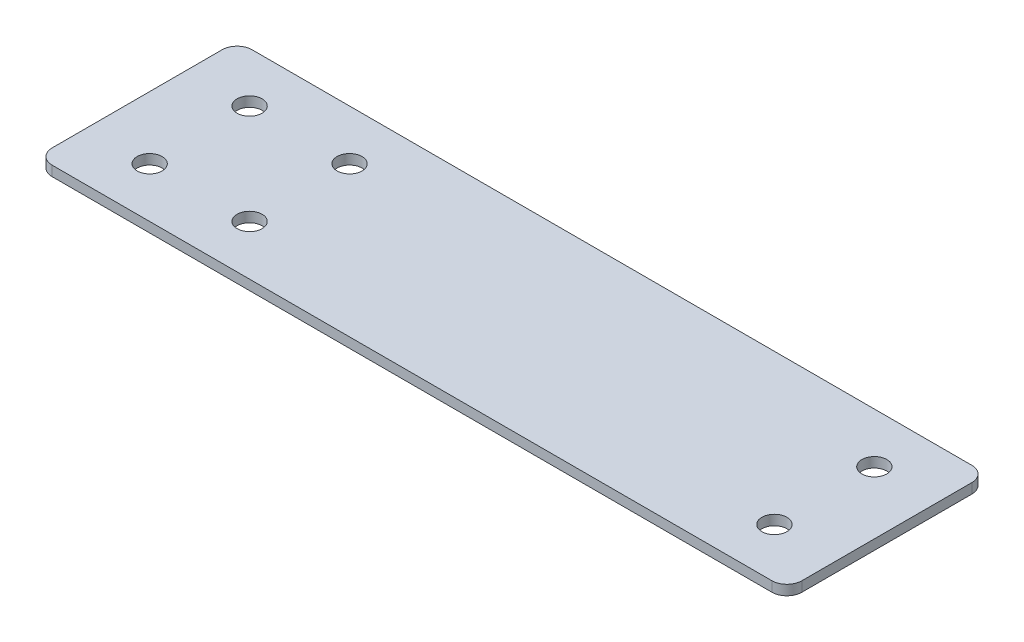
ISO-10303-21;
HEADER;
FILE_DESCRIPTION(('STEP AP214'),'2;1');
FILE_NAME('part.step','',(''),(''),'','','');
FILE_SCHEMA(('AUTOMOTIVE_DESIGN { 1 0 10303 214 1 1 1 1 }'));
ENDSEC;
DATA;
#1=APPLICATION_CONTEXT('core data for automotive mechanical design processes');
#2=APPLICATION_PROTOCOL_DEFINITION('international standard','automotive_design',2000,#1);
#3=PRODUCT_CONTEXT('',#1,'mechanical');
#4=PRODUCT('Part','Part','',(#3));
#5=PRODUCT_RELATED_PRODUCT_CATEGORY('part','',(#4));
#6=PRODUCT_DEFINITION_FORMATION('','',#4);
#7=PRODUCT_DEFINITION_CONTEXT('part definition',#1,'design');
#8=PRODUCT_DEFINITION('design','',#6,#7);
#9=PRODUCT_DEFINITION_SHAPE('','',#8);
#10=(LENGTH_UNIT() NAMED_UNIT(*) SI_UNIT(.MILLI.,.METRE.));
#11=(NAMED_UNIT(*) PLANE_ANGLE_UNIT() SI_UNIT($,.RADIAN.));
#12=(NAMED_UNIT(*) SI_UNIT($,.STERADIAN.) SOLID_ANGLE_UNIT());
#13=UNCERTAINTY_MEASURE_WITH_UNIT(LENGTH_MEASURE(1.E-05),#10,'distance_accuracy_value','');
#14=(GEOMETRIC_REPRESENTATION_CONTEXT(3) GLOBAL_UNCERTAINTY_ASSIGNED_CONTEXT((#13)) GLOBAL_UNIT_ASSIGNED_CONTEXT((#10,
#11,#12)) REPRESENTATION_CONTEXT('',''));
#15=CARTESIAN_POINT('',(0.,0.,0.));
#16=DIRECTION('',(0.,0.,1.));
#17=DIRECTION('',(1.,0.,0.));
#18=AXIS2_PLACEMENT_3D('',#15,#16,#17);
#19=CARTESIAN_POINT('',(-72.,2.,17.));
#20=DIRECTION('',(0.,-1.,0.));
#21=DIRECTION('',(0.,0.,-1.));
#22=AXIS2_PLACEMENT_3D('',#19,#20,#21);
#23=CYLINDRICAL_SURFACE('',#22,3.);
#24=CARTESIAN_POINT('',(-72.,0.,17.));
#25=DIRECTION('',(0.,1.,0.));
#26=DIRECTION('',(0.,0.,-1.));
#27=AXIS2_PLACEMENT_3D('',#24,#25,#26);
#28=CIRCLE('',#27,3.);
#29=CARTESIAN_POINT('',(-75.,0.,17.));
#30=VERTEX_POINT('',#29);
#31=CARTESIAN_POINT('',(-72.,0.,20.));
#32=VERTEX_POINT('',#31);
#33=EDGE_CURVE('E146',#30,#32,#28,.T.);
#34=ORIENTED_EDGE('',*,*,#33,.T.);
#35=DIRECTION('',(0.,-1.,0.));
#36=VECTOR('',#35,1.);
#37=CARTESIAN_POINT('',(-72.,2.,20.));
#38=LINE('',#37,#36);
#39=CARTESIAN_POINT('',(-72.,2.,20.));
#40=VERTEX_POINT('',#39);
#41=EDGE_CURVE('E11',#40,#32,#38,.T.);
#42=ORIENTED_EDGE('',*,*,#41,.F.);
#43=CARTESIAN_POINT('',(-72.,2.,17.));
#44=DIRECTION('',(0.,1.,0.));
#45=DIRECTION('',(0.,0.,-1.));
#46=AXIS2_PLACEMENT_3D('',#43,#44,#45);
#47=CIRCLE('',#46,3.);
#48=CARTESIAN_POINT('',(-75.,2.,17.));
#49=VERTEX_POINT('',#48);
#50=EDGE_CURVE('E169',#49,#40,#47,.T.);
#51=ORIENTED_EDGE('',*,*,#50,.F.);
#52=DIRECTION('',(0.,-1.,0.));
#53=VECTOR('',#52,1.);
#54=CARTESIAN_POINT('',(-75.,2.,17.));
#55=LINE('',#54,#53);
#56=EDGE_CURVE('E142',#49,#30,#55,.T.);
#57=ORIENTED_EDGE('',*,*,#56,.T.);
#58=EDGE_LOOP('',(#34,#42,#51,#57));
#59=FACE_BOUND('',#58,.T.);
#60=ADVANCED_FACE('F44',(#59),#23,.T.);
#61=CARTESIAN_POINT('',(72.,2.,20.));
#62=DIRECTION('',(0.,0.,-1.));
#63=DIRECTION('',(-1.,0.,0.));
#64=AXIS2_PLACEMENT_3D('',#61,#62,#63);
#65=PLANE('',#64);
#66=DIRECTION('',(1.,0.,0.));
#67=VECTOR('',#66,1.);
#68=CARTESIAN_POINT('',(72.,0.,20.));
#69=LINE('',#68,#67);
#70=CARTESIAN_POINT('',(72.,0.,20.));
#71=VERTEX_POINT('',#70);
#72=EDGE_CURVE('E150',#32,#71,#69,.T.);
#73=ORIENTED_EDGE('',*,*,#72,.T.);
#74=DIRECTION('',(0.,-1.,0.));
#75=VECTOR('',#74,1.);
#76=CARTESIAN_POINT('',(72.,2.,20.));
#77=LINE('',#76,#75);
#78=CARTESIAN_POINT('',(72.,2.,20.));
#79=VERTEX_POINT('',#78);
#80=EDGE_CURVE('E53',#79,#71,#77,.T.);
#81=ORIENTED_EDGE('',*,*,#80,.F.);
#82=DIRECTION('',(1.,0.,0.));
#83=VECTOR('',#82,1.);
#84=CARTESIAN_POINT('',(72.,2.,20.));
#85=LINE('',#84,#83);
#86=EDGE_CURVE('E104',#40,#79,#85,.T.);
#87=ORIENTED_EDGE('',*,*,#86,.F.);
#88=ORIENTED_EDGE('',*,*,#41,.T.);
#89=EDGE_LOOP('',(#73,#81,#87,#88));
#90=FACE_BOUND('',#89,.T.);
#91=ADVANCED_FACE('F296',(#90),#65,.F.);
#92=CARTESIAN_POINT('',(72.,2.,17.));
#93=DIRECTION('',(0.,-1.,0.));
#94=DIRECTION('',(0.,0.,-1.));
#95=AXIS2_PLACEMENT_3D('',#92,#93,#94);
#96=CYLINDRICAL_SURFACE('',#95,3.);
#97=CARTESIAN_POINT('',(72.,0.,17.));
#98=DIRECTION('',(0.,1.,0.));
#99=DIRECTION('',(0.,0.,1.));
#100=AXIS2_PLACEMENT_3D('',#97,#98,#99);
#101=CIRCLE('',#100,3.);
#102=CARTESIAN_POINT('',(75.,0.,17.));
#103=VERTEX_POINT('',#102);
#104=EDGE_CURVE('E154',#71,#103,#101,.T.);
#105=ORIENTED_EDGE('',*,*,#104,.T.);
#106=DIRECTION('',(0.,-1.,0.));
#107=VECTOR('',#106,1.);
#108=CARTESIAN_POINT('',(75.,2.,17.));
#109=LINE('',#108,#107);
#110=CARTESIAN_POINT('',(75.,2.,17.));
#111=VERTEX_POINT('',#110);
#112=EDGE_CURVE('E180',#111,#103,#109,.T.);
#113=ORIENTED_EDGE('',*,*,#112,.F.);
#114=CARTESIAN_POINT('',(72.,2.,17.));
#115=DIRECTION('',(0.,1.,0.));
#116=DIRECTION('',(0.,0.,1.));
#117=AXIS2_PLACEMENT_3D('',#114,#115,#116);
#118=CIRCLE('',#117,3.);
#119=EDGE_CURVE('E191',#79,#111,#118,.T.);
#120=ORIENTED_EDGE('',*,*,#119,.F.);
#121=ORIENTED_EDGE('',*,*,#80,.T.);
#122=EDGE_LOOP('',(#105,#113,#120,#121));
#123=FACE_BOUND('',#122,.T.);
#124=ADVANCED_FACE('F189',(#123),#96,.T.);
#125=CARTESIAN_POINT('',(75.,2.,17.));
#126=DIRECTION('',(-1.,0.,0.));
#127=DIRECTION('',(0.,0.,1.));
#128=AXIS2_PLACEMENT_3D('',#125,#126,#127);
#129=PLANE('',#128);
#130=DIRECTION('',(0.,0.,-1.));
#131=VECTOR('',#130,1.);
#132=CARTESIAN_POINT('',(75.,0.,17.));
#133=LINE('',#132,#131);
#134=CARTESIAN_POINT('',(75.,0.,-17.));
#135=VERTEX_POINT('',#134);
#136=EDGE_CURVE('E157',#103,#135,#133,.T.);
#137=ORIENTED_EDGE('',*,*,#136,.T.);
#138=DIRECTION('',(0.,-1.,0.));
#139=VECTOR('',#138,1.);
#140=CARTESIAN_POINT('',(75.,2.,-17.));
#141=LINE('',#140,#139);
#142=CARTESIAN_POINT('',(75.,2.,-17.));
#143=VERTEX_POINT('',#142);
#144=EDGE_CURVE('E176',#143,#135,#141,.T.);
#145=ORIENTED_EDGE('',*,*,#144,.F.);
#146=DIRECTION('',(0.,0.,-1.));
#147=VECTOR('',#146,1.);
#148=CARTESIAN_POINT('',(75.,2.,17.));
#149=LINE('',#148,#147);
#150=EDGE_CURVE('E204',#111,#143,#149,.T.);
#151=ORIENTED_EDGE('',*,*,#150,.F.);
#152=ORIENTED_EDGE('',*,*,#112,.T.);
#153=EDGE_LOOP('',(#137,#145,#151,#152));
#154=FACE_BOUND('',#153,.T.);
#155=ADVANCED_FACE('F199',(#154),#129,.F.);
#156=CARTESIAN_POINT('',(72.,2.,-17.));
#157=DIRECTION('',(0.,-1.,0.));
#158=DIRECTION('',(0.,0.,-1.));
#159=AXIS2_PLACEMENT_3D('',#156,#157,#158);
#160=CYLINDRICAL_SURFACE('',#159,3.);
#161=CARTESIAN_POINT('',(72.,0.,-17.));
#162=DIRECTION('',(0.,1.,0.));
#163=DIRECTION('',(0.,0.,1.));
#164=AXIS2_PLACEMENT_3D('',#161,#162,#163);
#165=CIRCLE('',#164,3.);
#166=CARTESIAN_POINT('',(72.,0.,-20.));
#167=VERTEX_POINT('',#166);
#168=EDGE_CURVE('E160',#135,#167,#165,.T.);
#169=ORIENTED_EDGE('',*,*,#168,.T.);
#170=DIRECTION('',(0.,-1.,0.));
#171=VECTOR('',#170,1.);
#172=CARTESIAN_POINT('',(72.,2.,-20.));
#173=LINE('',#172,#171);
#174=CARTESIAN_POINT('',(72.,2.,-20.));
#175=VERTEX_POINT('',#174);
#176=EDGE_CURVE('E134',#175,#167,#173,.T.);
#177=ORIENTED_EDGE('',*,*,#176,.F.);
#178=CARTESIAN_POINT('',(72.,2.,-17.));
#179=DIRECTION('',(0.,1.,0.));
#180=DIRECTION('',(0.,0.,1.));
#181=AXIS2_PLACEMENT_3D('',#178,#179,#180);
#182=CIRCLE('',#181,3.);
#183=EDGE_CURVE('E123',#143,#175,#182,.T.);
#184=ORIENTED_EDGE('',*,*,#183,.F.);
#185=ORIENTED_EDGE('',*,*,#144,.T.);
#186=EDGE_LOOP('',(#169,#177,#184,#185));
#187=FACE_BOUND('',#186,.T.);
#188=ADVANCED_FACE('F202',(#187),#160,.T.);
#189=CARTESIAN_POINT('',(72.,2.,-20.));
#190=DIRECTION('',(0.,0.,1.));
#191=DIRECTION('',(1.,0.,0.));
#192=AXIS2_PLACEMENT_3D('',#189,#190,#191);
#193=PLANE('',#192);
#194=DIRECTION('',(-1.,0.,0.));
#195=VECTOR('',#194,1.);
#196=CARTESIAN_POINT('',(72.,0.,-20.));
#197=LINE('',#196,#195);
#198=CARTESIAN_POINT('',(-72.,0.,-20.));
#199=VERTEX_POINT('',#198);
#200=EDGE_CURVE('E132',#167,#199,#197,.T.);
#201=ORIENTED_EDGE('',*,*,#200,.T.);
#202=DIRECTION('',(0.,-1.,0.));
#203=VECTOR('',#202,1.);
#204=CARTESIAN_POINT('',(-72.,2.,-20.));
#205=LINE('',#204,#203);
#206=CARTESIAN_POINT('',(-72.,2.,-20.));
#207=VERTEX_POINT('',#206);
#208=EDGE_CURVE('E129',#207,#199,#205,.T.);
#209=ORIENTED_EDGE('',*,*,#208,.F.);
#210=DIRECTION('',(-1.,0.,0.));
#211=VECTOR('',#210,1.);
#212=CARTESIAN_POINT('',(72.,2.,-20.));
#213=LINE('',#212,#211);
#214=EDGE_CURVE('E117',#175,#207,#213,.T.);
#215=ORIENTED_EDGE('',*,*,#214,.F.);
#216=ORIENTED_EDGE('',*,*,#176,.T.);
#217=EDGE_LOOP('',(#201,#209,#215,#216));
#218=FACE_BOUND('',#217,.T.);
#219=ADVANCED_FACE('F130',(#218),#193,.F.);
#220=CARTESIAN_POINT('',(-72.,2.,-17.));
#221=DIRECTION('',(0.,-1.,0.));
#222=DIRECTION('',(0.,0.,-1.));
#223=AXIS2_PLACEMENT_3D('',#220,#221,#222);
#224=CYLINDRICAL_SURFACE('',#223,3.);
#225=CARTESIAN_POINT('',(-72.,0.,-17.));
#226=DIRECTION('',(0.,1.,0.));
#227=DIRECTION('',(0.,0.,1.));
#228=AXIS2_PLACEMENT_3D('',#225,#226,#227);
#229=CIRCLE('',#228,3.);
#230=CARTESIAN_POINT('',(-75.,0.,-17.));
#231=VERTEX_POINT('',#230);
#232=EDGE_CURVE('E90',#199,#231,#229,.T.);
#233=ORIENTED_EDGE('',*,*,#232,.T.);
#234=DIRECTION('',(0.,-1.,0.));
#235=VECTOR('',#234,1.);
#236=CARTESIAN_POINT('',(-75.,2.,-17.));
#237=LINE('',#236,#235);
#238=CARTESIAN_POINT('',(-75.,2.,-17.));
#239=VERTEX_POINT('',#238);
#240=EDGE_CURVE('E135',#239,#231,#237,.T.);
#241=ORIENTED_EDGE('',*,*,#240,.F.);
#242=CARTESIAN_POINT('',(-72.,2.,-17.));
#243=DIRECTION('',(0.,1.,0.));
#244=DIRECTION('',(0.,0.,1.));
#245=AXIS2_PLACEMENT_3D('',#242,#243,#244);
#246=CIRCLE('',#245,3.);
#247=EDGE_CURVE('E121',#207,#239,#246,.T.);
#248=ORIENTED_EDGE('',*,*,#247,.F.);
#249=ORIENTED_EDGE('',*,*,#208,.T.);
#250=EDGE_LOOP('',(#233,#241,#248,#249));
#251=FACE_BOUND('',#250,.T.);
#252=ADVANCED_FACE('F137',(#251),#224,.T.);
#253=CARTESIAN_POINT('',(-75.,2.,17.));
#254=DIRECTION('',(1.,0.,0.));
#255=DIRECTION('',(0.,0.,-1.));
#256=AXIS2_PLACEMENT_3D('',#253,#254,#255);
#257=PLANE('',#256);
#258=DIRECTION('',(0.,0.,1.));
#259=VECTOR('',#258,1.);
#260=CARTESIAN_POINT('',(-75.,0.,17.));
#261=LINE('',#260,#259);
#262=EDGE_CURVE('E96',#231,#30,#261,.T.);
#263=ORIENTED_EDGE('',*,*,#262,.T.);
#264=ORIENTED_EDGE('',*,*,#56,.F.);
#265=DIRECTION('',(0.,0.,1.));
#266=VECTOR('',#265,1.);
#267=CARTESIAN_POINT('',(-75.,2.,17.));
#268=LINE('',#267,#266);
#269=EDGE_CURVE('E61',#239,#49,#268,.T.);
#270=ORIENTED_EDGE('',*,*,#269,.F.);
#271=ORIENTED_EDGE('',*,*,#240,.T.);
#272=EDGE_LOOP('',(#263,#264,#270,#271));
#273=FACE_BOUND('',#272,.T.);
#274=ADVANCED_FACE('F268',(#273),#257,.F.);
#275=CARTESIAN_POINT('',(-72.,2.,17.));
#276=DIRECTION('',(0.,-1.,0.));
#277=DIRECTION('',(0.,0.,-1.));
#278=AXIS2_PLACEMENT_3D('',#275,#276,#277);
#279=PLANE('',#278);
#280=CARTESIAN_POINT('',(-62.5,2.,-9.99999999999999));
#281=DIRECTION('',(0.,1.,0.));
#282=DIRECTION('',(0.,0.,1.));
#283=AXIS2_PLACEMENT_3D('',#280,#281,#282);
#284=CIRCLE('',#283,2.5);
#285=CARTESIAN_POINT('',(-62.5,2.,-7.49999999999998));
#286=VERTEX_POINT('',#285);
#287=EDGE_CURVE('E258',#286,#286,#284,.T.);
#288=ORIENTED_EDGE('',*,*,#287,.F.);
#289=EDGE_LOOP('',(#288));
#290=FACE_BOUND('',#289,.T.);
#291=CARTESIAN_POINT('',(-62.5,2.,10.));
#292=DIRECTION('',(0.,1.,0.));
#293=DIRECTION('',(0.,0.,1.));
#294=AXIS2_PLACEMENT_3D('',#291,#292,#293);
#295=CIRCLE('',#294,2.5);
#296=CARTESIAN_POINT('',(-62.5,2.,12.5));
#297=VERTEX_POINT('',#296);
#298=EDGE_CURVE('E250',#297,#297,#295,.T.);
#299=ORIENTED_EDGE('',*,*,#298,.F.);
#300=EDGE_LOOP('',(#299));
#301=FACE_BOUND('',#300,.T.);
#302=CARTESIAN_POINT('',(-42.5,2.,10.));
#303=DIRECTION('',(0.,1.,0.));
#304=DIRECTION('',(0.,0.,1.));
#305=AXIS2_PLACEMENT_3D('',#302,#303,#304);
#306=CIRCLE('',#305,2.5);
#307=CARTESIAN_POINT('',(-42.5,2.,12.5));
#308=VERTEX_POINT('',#307);
#309=EDGE_CURVE('E242',#308,#308,#306,.T.);
#310=ORIENTED_EDGE('',*,*,#309,.F.);
#311=EDGE_LOOP('',(#310));
#312=FACE_BOUND('',#311,.T.);
#313=CARTESIAN_POINT('',(-42.5,2.,-9.99999999999999));
#314=DIRECTION('',(0.,1.,0.));
#315=DIRECTION('',(0.,0.,1.));
#316=AXIS2_PLACEMENT_3D('',#313,#314,#315);
#317=CIRCLE('',#316,2.5);
#318=CARTESIAN_POINT('',(-42.5,2.,-7.49999999999998));
#319=VERTEX_POINT('',#318);
#320=EDGE_CURVE('E234',#319,#319,#317,.T.);
#321=ORIENTED_EDGE('',*,*,#320,.F.);
#322=EDGE_LOOP('',(#321));
#323=FACE_BOUND('',#322,.T.);
#324=CARTESIAN_POINT('',(62.5,2.,-9.99999999999999));
#325=DIRECTION('',(0.,1.,0.));
#326=DIRECTION('',(0.,0.,1.));
#327=AXIS2_PLACEMENT_3D('',#324,#325,#326);
#328=CIRCLE('',#327,2.5);
#329=CARTESIAN_POINT('',(62.5,2.,-7.49999999999998));
#330=VERTEX_POINT('',#329);
#331=EDGE_CURVE('E226',#330,#330,#328,.T.);
#332=ORIENTED_EDGE('',*,*,#331,.F.);
#333=EDGE_LOOP('',(#332));
#334=FACE_BOUND('',#333,.T.);
#335=CARTESIAN_POINT('',(62.5,2.,10.));
#336=DIRECTION('',(0.,1.,0.));
#337=DIRECTION('',(0.,0.,1.));
#338=AXIS2_PLACEMENT_3D('',#335,#336,#337);
#339=CIRCLE('',#338,2.5);
#340=CARTESIAN_POINT('',(62.5,2.,12.5));
#341=VERTEX_POINT('',#340);
#342=EDGE_CURVE('E218',#341,#341,#339,.T.);
#343=ORIENTED_EDGE('',*,*,#342,.F.);
#344=EDGE_LOOP('',(#343));
#345=FACE_BOUND('',#344,.T.);
#346=ORIENTED_EDGE('',*,*,#50,.T.);
#347=ORIENTED_EDGE('',*,*,#86,.T.);
#348=ORIENTED_EDGE('',*,*,#119,.T.);
#349=ORIENTED_EDGE('',*,*,#150,.T.);
#350=ORIENTED_EDGE('',*,*,#183,.T.);
#351=ORIENTED_EDGE('',*,*,#214,.T.);
#352=ORIENTED_EDGE('',*,*,#247,.T.);
#353=ORIENTED_EDGE('',*,*,#269,.T.);
#354=EDGE_LOOP('',(#346,#347,#348,#349,#350,#351,#352,#353));
#355=FACE_BOUND('',#354,.T.);
#356=ADVANCED_FACE('F119',(#290,#301,#312,#323,#334,#345,#355),#279,.F.);
#357=CARTESIAN_POINT('',(-72.,0.,17.));
#358=DIRECTION('',(0.,-1.,0.));
#359=DIRECTION('',(0.,0.,-1.));
#360=AXIS2_PLACEMENT_3D('',#357,#358,#359);
#361=PLANE('',#360);
#362=CARTESIAN_POINT('',(-62.5,0.,-9.99999999999999));
#363=DIRECTION('',(0.,1.,0.));
#364=DIRECTION('',(0.,0.,1.));
#365=AXIS2_PLACEMENT_3D('',#362,#363,#364);
#366=CIRCLE('',#365,2.5);
#367=CARTESIAN_POINT('',(-62.5,0.,-7.49999999999998));
#368=VERTEX_POINT('',#367);
#369=EDGE_CURVE('E254',#368,#368,#366,.T.);
#370=ORIENTED_EDGE('',*,*,#369,.T.);
#371=EDGE_LOOP('',(#370));
#372=FACE_BOUND('',#371,.T.);
#373=CARTESIAN_POINT('',(-62.5,0.,10.));
#374=DIRECTION('',(0.,1.,0.));
#375=DIRECTION('',(0.,0.,1.));
#376=AXIS2_PLACEMENT_3D('',#373,#374,#375);
#377=CIRCLE('',#376,2.5);
#378=CARTESIAN_POINT('',(-62.5,0.,12.5));
#379=VERTEX_POINT('',#378);
#380=EDGE_CURVE('E246',#379,#379,#377,.T.);
#381=ORIENTED_EDGE('',*,*,#380,.T.);
#382=EDGE_LOOP('',(#381));
#383=FACE_BOUND('',#382,.T.);
#384=CARTESIAN_POINT('',(-42.5,0.,10.));
#385=DIRECTION('',(0.,1.,0.));
#386=DIRECTION('',(0.,0.,1.));
#387=AXIS2_PLACEMENT_3D('',#384,#385,#386);
#388=CIRCLE('',#387,2.5);
#389=CARTESIAN_POINT('',(-42.5,0.,12.5));
#390=VERTEX_POINT('',#389);
#391=EDGE_CURVE('E238',#390,#390,#388,.T.);
#392=ORIENTED_EDGE('',*,*,#391,.T.);
#393=EDGE_LOOP('',(#392));
#394=FACE_BOUND('',#393,.T.);
#395=CARTESIAN_POINT('',(-42.5,0.,-9.99999999999999));
#396=DIRECTION('',(0.,1.,0.));
#397=DIRECTION('',(0.,0.,1.));
#398=AXIS2_PLACEMENT_3D('',#395,#396,#397);
#399=CIRCLE('',#398,2.5);
#400=CARTESIAN_POINT('',(-42.5,0.,-7.49999999999998));
#401=VERTEX_POINT('',#400);
#402=EDGE_CURVE('E230',#401,#401,#399,.T.);
#403=ORIENTED_EDGE('',*,*,#402,.T.);
#404=EDGE_LOOP('',(#403));
#405=FACE_BOUND('',#404,.T.);
#406=CARTESIAN_POINT('',(62.5,0.,-9.99999999999999));
#407=DIRECTION('',(0.,1.,0.));
#408=DIRECTION('',(0.,0.,1.));
#409=AXIS2_PLACEMENT_3D('',#406,#407,#408);
#410=CIRCLE('',#409,2.5);
#411=CARTESIAN_POINT('',(62.5,0.,-7.49999999999998));
#412=VERTEX_POINT('',#411);
#413=EDGE_CURVE('E222',#412,#412,#410,.T.);
#414=ORIENTED_EDGE('',*,*,#413,.T.);
#415=EDGE_LOOP('',(#414));
#416=FACE_BOUND('',#415,.T.);
#417=CARTESIAN_POINT('',(62.5,0.,10.));
#418=DIRECTION('',(0.,1.,0.));
#419=DIRECTION('',(0.,0.,1.));
#420=AXIS2_PLACEMENT_3D('',#417,#418,#419);
#421=CIRCLE('',#420,2.5);
#422=CARTESIAN_POINT('',(62.5,0.,12.5));
#423=VERTEX_POINT('',#422);
#424=EDGE_CURVE('E151',#423,#423,#421,.T.);
#425=ORIENTED_EDGE('',*,*,#424,.T.);
#426=EDGE_LOOP('',(#425));
#427=FACE_BOUND('',#426,.T.);
#428=ORIENTED_EDGE('',*,*,#33,.F.);
#429=ORIENTED_EDGE('',*,*,#262,.F.);
#430=ORIENTED_EDGE('',*,*,#232,.F.);
#431=ORIENTED_EDGE('',*,*,#200,.F.);
#432=ORIENTED_EDGE('',*,*,#168,.F.);
#433=ORIENTED_EDGE('',*,*,#136,.F.);
#434=ORIENTED_EDGE('',*,*,#104,.F.);
#435=ORIENTED_EDGE('',*,*,#72,.F.);
#436=EDGE_LOOP('',(#428,#429,#430,#431,#432,#433,#434,#435));
#437=FACE_BOUND('',#436,.T.);
#438=ADVANCED_FACE('F195',(#372,#383,#394,#405,#416,#427,#437),#361,.T.);
#439=CARTESIAN_POINT('',(62.5,2.,10.));
#440=DIRECTION('',(0.,1.,0.));
#441=DIRECTION('',(0.,0.,1.));
#442=AXIS2_PLACEMENT_3D('',#439,#440,#441);
#443=CYLINDRICAL_SURFACE('',#442,2.5);
#444=ORIENTED_EDGE('',*,*,#424,.F.);
#445=EDGE_LOOP('',(#444));
#446=FACE_BOUND('',#445,.T.);
#447=ORIENTED_EDGE('',*,*,#342,.T.);
#448=EDGE_LOOP('',(#447));
#449=FACE_BOUND('',#448,.T.);
#450=ADVANCED_FACE('F280',(#446,#449),#443,.F.);
#451=CARTESIAN_POINT('',(62.5,2.,-9.99999999999999));
#452=DIRECTION('',(0.,1.,0.));
#453=DIRECTION('',(0.,0.,1.));
#454=AXIS2_PLACEMENT_3D('',#451,#452,#453);
#455=CYLINDRICAL_SURFACE('',#454,2.5);
#456=ORIENTED_EDGE('',*,*,#413,.F.);
#457=EDGE_LOOP('',(#456));
#458=FACE_BOUND('',#457,.T.);
#459=ORIENTED_EDGE('',*,*,#331,.T.);
#460=EDGE_LOOP('',(#459));
#461=FACE_BOUND('',#460,.T.);
#462=ADVANCED_FACE('F282',(#458,#461),#455,.F.);
#463=CARTESIAN_POINT('',(-42.5,2.,-9.99999999999999));
#464=DIRECTION('',(0.,1.,0.));
#465=DIRECTION('',(0.,0.,1.));
#466=AXIS2_PLACEMENT_3D('',#463,#464,#465);
#467=CYLINDRICAL_SURFACE('',#466,2.5);
#468=ORIENTED_EDGE('',*,*,#402,.F.);
#469=EDGE_LOOP('',(#468));
#470=FACE_BOUND('',#469,.T.);
#471=ORIENTED_EDGE('',*,*,#320,.T.);
#472=EDGE_LOOP('',(#471));
#473=FACE_BOUND('',#472,.T.);
#474=ADVANCED_FACE('F289',(#470,#473),#467,.F.);
#475=CARTESIAN_POINT('',(-42.5,2.,10.));
#476=DIRECTION('',(0.,1.,0.));
#477=DIRECTION('',(0.,0.,1.));
#478=AXIS2_PLACEMENT_3D('',#475,#476,#477);
#479=CYLINDRICAL_SURFACE('',#478,2.5);
#480=ORIENTED_EDGE('',*,*,#391,.F.);
#481=EDGE_LOOP('',(#480));
#482=FACE_BOUND('',#481,.T.);
#483=ORIENTED_EDGE('',*,*,#309,.T.);
#484=EDGE_LOOP('',(#483));
#485=FACE_BOUND('',#484,.T.);
#486=ADVANCED_FACE('F381',(#482,#485),#479,.F.);
#487=CARTESIAN_POINT('',(-62.5,2.,10.));
#488=DIRECTION('',(0.,1.,0.));
#489=DIRECTION('',(0.,0.,1.));
#490=AXIS2_PLACEMENT_3D('',#487,#488,#489);
#491=CYLINDRICAL_SURFACE('',#490,2.5);
#492=ORIENTED_EDGE('',*,*,#380,.F.);
#493=EDGE_LOOP('',(#492));
#494=FACE_BOUND('',#493,.T.);
#495=ORIENTED_EDGE('',*,*,#298,.T.);
#496=EDGE_LOOP('',(#495));
#497=FACE_BOUND('',#496,.T.);
#498=ADVANCED_FACE('F391',(#494,#497),#491,.F.);
#499=CARTESIAN_POINT('',(-62.5,2.,-9.99999999999999));
#500=DIRECTION('',(0.,1.,0.));
#501=DIRECTION('',(0.,0.,1.));
#502=AXIS2_PLACEMENT_3D('',#499,#500,#501);
#503=CYLINDRICAL_SURFACE('',#502,2.5);
#504=ORIENTED_EDGE('',*,*,#369,.F.);
#505=EDGE_LOOP('',(#504));
#506=FACE_BOUND('',#505,.T.);
#507=ORIENTED_EDGE('',*,*,#287,.T.);
#508=EDGE_LOOP('',(#507));
#509=FACE_BOUND('',#508,.T.);
#510=ADVANCED_FACE('F264',(#506,#509),#503,.F.);
#511=CLOSED_SHELL('',(#60,#91,#124,#155,#188,#219,#252,#274,#356,#438,#450,#462,#474,#486,#498,#510));
#512=MANIFOLD_SOLID_BREP('B2',#511);
#513=ADVANCED_BREP_SHAPE_REPRESENTATION('',(#18,#512),#14);
#514=SHAPE_DEFINITION_REPRESENTATION(#9,#513);
ENDSEC;
END-ISO-10303-21;
